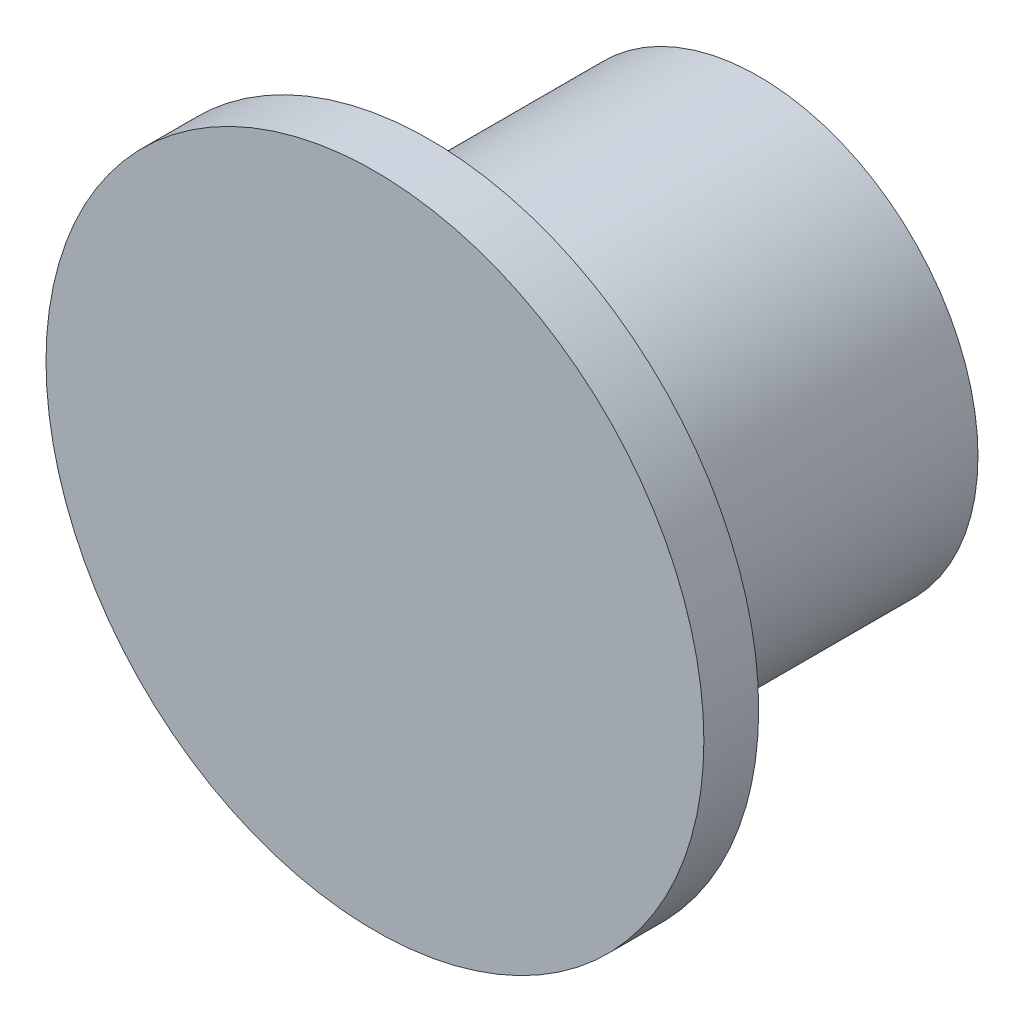
ISO-10303-21;
HEADER;
FILE_DESCRIPTION(('STEP AP214'),'2;1');
FILE_NAME('part.step','',(''),(''),'','','');
FILE_SCHEMA(('AUTOMOTIVE_DESIGN { 1 0 10303 214 1 1 1 1 }'));
ENDSEC;
DATA;
#1=APPLICATION_CONTEXT('core data for automotive mechanical design processes');
#2=APPLICATION_PROTOCOL_DEFINITION('international standard','automotive_design',2000,#1);
#3=PRODUCT_CONTEXT('',#1,'mechanical');
#4=PRODUCT('Part','Part','',(#3));
#5=PRODUCT_RELATED_PRODUCT_CATEGORY('part','',(#4));
#6=PRODUCT_DEFINITION_FORMATION('','',#4);
#7=PRODUCT_DEFINITION_CONTEXT('part definition',#1,'design');
#8=PRODUCT_DEFINITION('design','',#6,#7);
#9=PRODUCT_DEFINITION_SHAPE('','',#8);
#10=(LENGTH_UNIT() NAMED_UNIT(*) SI_UNIT(.MILLI.,.METRE.));
#11=(NAMED_UNIT(*) PLANE_ANGLE_UNIT() SI_UNIT($,.RADIAN.));
#12=(NAMED_UNIT(*) SI_UNIT($,.STERADIAN.) SOLID_ANGLE_UNIT());
#13=UNCERTAINTY_MEASURE_WITH_UNIT(LENGTH_MEASURE(1.E-05),#10,'distance_accuracy_value','');
#14=(GEOMETRIC_REPRESENTATION_CONTEXT(3) GLOBAL_UNCERTAINTY_ASSIGNED_CONTEXT((#13)) GLOBAL_UNIT_ASSIGNED_CONTEXT((#10,
#11,#12)) REPRESENTATION_CONTEXT('',''));
#15=CARTESIAN_POINT('',(0.,0.,0.));
#16=DIRECTION('',(0.,0.,1.));
#17=DIRECTION('',(1.,0.,0.));
#18=AXIS2_PLACEMENT_3D('',#15,#16,#17);
#19=CARTESIAN_POINT('',(0.,0.,6.));
#20=DIRECTION('',(0.,0.,-1.));
#21=DIRECTION('',(-1.,0.,0.));
#22=AXIS2_PLACEMENT_3D('',#19,#20,#21);
#23=CYLINDRICAL_SURFACE('',#22,4.);
#24=CARTESIAN_POINT('',(0.,0.,6.));
#25=DIRECTION('',(0.,0.,1.));
#26=DIRECTION('',(1.,0.,0.));
#27=AXIS2_PLACEMENT_3D('',#24,#25,#26);
#28=CIRCLE('',#27,4.);
#29=CARTESIAN_POINT('',(4.,0.,6.));
#30=VERTEX_POINT('',#29);
#31=EDGE_CURVE('E10',#30,#30,#28,.T.);
#32=ORIENTED_EDGE('',*,*,#31,.F.);
#33=EDGE_LOOP('',(#32));
#34=FACE_BOUND('',#33,.T.);
#35=CARTESIAN_POINT('',(0.,0.,0.));
#36=DIRECTION('',(0.,0.,1.));
#37=DIRECTION('',(1.,0.,0.));
#38=AXIS2_PLACEMENT_3D('',#35,#36,#37);
#39=CIRCLE('',#38,4.);
#40=CARTESIAN_POINT('',(4.,0.,0.));
#41=VERTEX_POINT('',#40);
#42=EDGE_CURVE('E39',#41,#41,#39,.T.);
#43=ORIENTED_EDGE('',*,*,#42,.T.);
#44=EDGE_LOOP('',(#43));
#45=FACE_BOUND('',#44,.T.);
#46=ADVANCED_FACE('F36',(#34,#45),#23,.T.);
#47=CARTESIAN_POINT('',(0.,0.,0.));
#48=DIRECTION('',(0.,0.,1.));
#49=DIRECTION('',(1.,0.,0.));
#50=AXIS2_PLACEMENT_3D('',#47,#48,#49);
#51=PLANE('',#50);
#52=ORIENTED_EDGE('',*,*,#42,.F.);
#53=EDGE_LOOP('',(#52));
#54=FACE_BOUND('',#53,.T.);
#55=ADVANCED_FACE('F59',(#54),#51,.F.);
#56=CARTESIAN_POINT('',(0.,0.,7.));
#57=DIRECTION('',(0.,0.,-1.));
#58=DIRECTION('',(-1.,0.,0.));
#59=AXIS2_PLACEMENT_3D('',#56,#57,#58);
#60=CYLINDRICAL_SURFACE('',#59,6.);
#61=CARTESIAN_POINT('',(0.,0.,7.));
#62=DIRECTION('',(0.,0.,1.));
#63=DIRECTION('',(1.,0.,0.));
#64=AXIS2_PLACEMENT_3D('',#61,#62,#63);
#65=CIRCLE('',#64,6.);
#66=CARTESIAN_POINT('',(6.,0.,7.));
#67=VERTEX_POINT('',#66);
#68=EDGE_CURVE('E46',#67,#67,#65,.T.);
#69=ORIENTED_EDGE('',*,*,#68,.F.);
#70=EDGE_LOOP('',(#69));
#71=FACE_BOUND('',#70,.T.);
#72=CARTESIAN_POINT('',(0.,0.,6.));
#73=DIRECTION('',(0.,0.,1.));
#74=DIRECTION('',(1.,0.,0.));
#75=AXIS2_PLACEMENT_3D('',#72,#73,#74);
#76=CIRCLE('',#75,6.);
#77=CARTESIAN_POINT('',(6.,0.,6.));
#78=VERTEX_POINT('',#77);
#79=EDGE_CURVE('E48',#78,#78,#76,.T.);
#80=ORIENTED_EDGE('',*,*,#79,.T.);
#81=EDGE_LOOP('',(#80));
#82=FACE_BOUND('',#81,.T.);
#83=ADVANCED_FACE('F56',(#71,#82),#60,.T.);
#84=CARTESIAN_POINT('',(0.,0.,7.));
#85=DIRECTION('',(0.,0.,1.));
#86=DIRECTION('',(1.,0.,0.));
#87=AXIS2_PLACEMENT_3D('',#84,#85,#86);
#88=PLANE('',#87);
#89=ORIENTED_EDGE('',*,*,#68,.T.);
#90=EDGE_LOOP('',(#89));
#91=FACE_BOUND('',#90,.T.);
#92=ADVANCED_FACE('F54',(#91),#88,.T.);
#93=CARTESIAN_POINT('',(0.,0.,6.));
#94=DIRECTION('',(0.,0.,1.));
#95=DIRECTION('',(1.,0.,0.));
#96=AXIS2_PLACEMENT_3D('',#93,#94,#95);
#97=PLANE('',#96);
#98=ORIENTED_EDGE('',*,*,#31,.T.);
#99=EDGE_LOOP('',(#98));
#100=FACE_BOUND('',#99,.T.);
#101=ORIENTED_EDGE('',*,*,#79,.F.);
#102=EDGE_LOOP('',(#101));
#103=FACE_BOUND('',#102,.T.);
#104=ADVANCED_FACE('F63',(#100,#103),#97,.F.);
#105=CLOSED_SHELL('',(#46,#55,#83,#92,#104));
#106=MANIFOLD_SOLID_BREP('B2',#105);
#107=ADVANCED_BREP_SHAPE_REPRESENTATION('',(#18,#106),#14);
#108=SHAPE_DEFINITION_REPRESENTATION(#9,#107);
ENDSEC;
END-ISO-10303-21;
